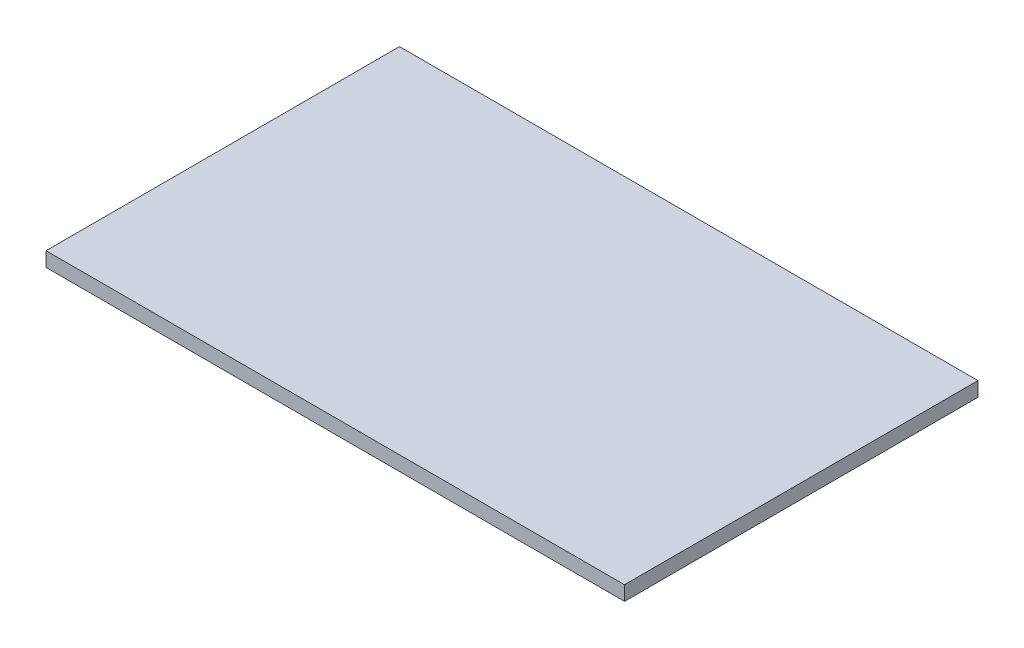
ISO-10303-21;
HEADER;
FILE_DESCRIPTION(('STEP AP214'),'2;1');
FILE_NAME('part.step','',(''),(''),'','','');
FILE_SCHEMA(('AUTOMOTIVE_DESIGN { 1 0 10303 214 1 1 1 1 }'));
ENDSEC;
DATA;
#1=APPLICATION_CONTEXT('core data for automotive mechanical design processes');
#2=APPLICATION_PROTOCOL_DEFINITION('international standard','automotive_design',2000,#1);
#3=PRODUCT_CONTEXT('',#1,'mechanical');
#4=PRODUCT('Part','Part','',(#3));
#5=PRODUCT_RELATED_PRODUCT_CATEGORY('part','',(#4));
#6=PRODUCT_DEFINITION_FORMATION('','',#4);
#7=PRODUCT_DEFINITION_CONTEXT('part definition',#1,'design');
#8=PRODUCT_DEFINITION('design','',#6,#7);
#9=PRODUCT_DEFINITION_SHAPE('','',#8);
#10=(LENGTH_UNIT() NAMED_UNIT(*) SI_UNIT(.MILLI.,.METRE.));
#11=(NAMED_UNIT(*) PLANE_ANGLE_UNIT() SI_UNIT($,.RADIAN.));
#12=(NAMED_UNIT(*) SI_UNIT($,.STERADIAN.) SOLID_ANGLE_UNIT());
#13=UNCERTAINTY_MEASURE_WITH_UNIT(LENGTH_MEASURE(1.E-05),#10,'distance_accuracy_value','');
#14=(GEOMETRIC_REPRESENTATION_CONTEXT(3) GLOBAL_UNCERTAINTY_ASSIGNED_CONTEXT((#13)) GLOBAL_UNIT_ASSIGNED_CONTEXT((#10,
#11,#12)) REPRESENTATION_CONTEXT('',''));
#15=CARTESIAN_POINT('',(0.,0.,0.));
#16=DIRECTION('',(0.,0.,1.));
#17=DIRECTION('',(1.,0.,0.));
#18=AXIS2_PLACEMENT_3D('',#15,#16,#17);
#19=CARTESIAN_POINT('',(3.4307,2.9756,1.6548999999999));
#20=DIRECTION('',(1.,0.,0.));
#21=DIRECTION('',(0.,-1.,0.));
#22=AXIS2_PLACEMENT_3D('',#19,#20,#21);
#23=PLANE('',#22);
#24=DIRECTION('',(0.,0.,1.));
#25=VECTOR('',#24,1.);
#26=CARTESIAN_POINT('',(3.4307,2.9306,1.6548999999999));
#27=LINE('',#26,#25);
#28=CARTESIAN_POINT('',(3.4307,2.9306,0.554899999999976));
#29=VERTEX_POINT('',#28);
#30=CARTESIAN_POINT('',(3.4307,2.9306,1.6548999999999));
#31=VERTEX_POINT('',#30);
#32=EDGE_CURVE('E11',#29,#31,#27,.T.);
#33=ORIENTED_EDGE('',*,*,#32,.T.);
#34=DIRECTION('',(0.,-1.,0.));
#35=VECTOR('',#34,1.);
#36=CARTESIAN_POINT('',(3.4307,2.9756,1.6548999999999));
#37=LINE('',#36,#35);
#38=CARTESIAN_POINT('',(3.4307,2.9756,1.6548999999999));
#39=VERTEX_POINT('',#38);
#40=EDGE_CURVE('E24',#39,#31,#37,.T.);
#41=ORIENTED_EDGE('',*,*,#40,.F.);
#42=DIRECTION('',(0.,0.,1.));
#43=VECTOR('',#42,1.);
#44=CARTESIAN_POINT('',(3.4307,2.9756,1.6548999999999));
#45=LINE('',#44,#43);
#46=CARTESIAN_POINT('',(3.4307,2.9756,0.554899999999976));
#47=VERTEX_POINT('',#46);
#48=EDGE_CURVE('E88',#47,#39,#45,.T.);
#49=ORIENTED_EDGE('',*,*,#48,.F.);
#50=DIRECTION('',(0.,-1.,0.));
#51=VECTOR('',#50,1.);
#52=CARTESIAN_POINT('',(3.4307,2.9756,0.554899999999976));
#53=LINE('',#52,#51);
#54=EDGE_CURVE('E77',#47,#29,#53,.T.);
#55=ORIENTED_EDGE('',*,*,#54,.T.);
#56=EDGE_LOOP('',(#33,#41,#49,#55));
#57=FACE_BOUND('',#56,.T.);
#58=ADVANCED_FACE('F17',(#57),#23,.F.);
#59=CARTESIAN_POINT('',(5.2307,2.9756,1.6548999999999));
#60=DIRECTION('',(0.,0.,-1.));
#61=DIRECTION('',(0.,1.,0.));
#62=AXIS2_PLACEMENT_3D('',#59,#60,#61);
#63=PLANE('',#62);
#64=DIRECTION('',(1.,0.,0.));
#65=VECTOR('',#64,1.);
#66=CARTESIAN_POINT('',(5.2307,2.9306,1.6548999999999));
#67=LINE('',#66,#65);
#68=CARTESIAN_POINT('',(5.2307,2.9306,1.6548999999999));
#69=VERTEX_POINT('',#68);
#70=EDGE_CURVE('E85',#31,#69,#67,.T.);
#71=ORIENTED_EDGE('',*,*,#70,.T.);
#72=DIRECTION('',(0.,-1.,0.));
#73=VECTOR('',#72,1.);
#74=CARTESIAN_POINT('',(5.2307,2.9756,1.6548999999999));
#75=LINE('',#74,#73);
#76=CARTESIAN_POINT('',(5.2307,2.9756,1.6548999999999));
#77=VERTEX_POINT('',#76);
#78=EDGE_CURVE('E83',#77,#69,#75,.T.);
#79=ORIENTED_EDGE('',*,*,#78,.F.);
#80=DIRECTION('',(1.,0.,0.));
#81=VECTOR('',#80,1.);
#82=CARTESIAN_POINT('',(5.2307,2.9756,1.6548999999999));
#83=LINE('',#82,#81);
#84=EDGE_CURVE('E72',#39,#77,#83,.T.);
#85=ORIENTED_EDGE('',*,*,#84,.F.);
#86=ORIENTED_EDGE('',*,*,#40,.T.);
#87=EDGE_LOOP('',(#71,#79,#85,#86));
#88=FACE_BOUND('',#87,.T.);
#89=ADVANCED_FACE('F90',(#88),#63,.F.);
#90=CARTESIAN_POINT('',(5.2307,2.9756,0.554899999999976));
#91=DIRECTION('',(-1.,0.,0.));
#92=DIRECTION('',(0.,1.,0.));
#93=AXIS2_PLACEMENT_3D('',#90,#91,#92);
#94=PLANE('',#93);
#95=DIRECTION('',(0.,0.,-1.));
#96=VECTOR('',#95,1.);
#97=CARTESIAN_POINT('',(5.2307,2.9306,0.554899999999976));
#98=LINE('',#97,#96);
#99=CARTESIAN_POINT('',(5.2307,2.9306,0.554899999999976));
#100=VERTEX_POINT('',#99);
#101=EDGE_CURVE('E60',#69,#100,#98,.T.);
#102=ORIENTED_EDGE('',*,*,#101,.T.);
#103=DIRECTION('',(0.,-1.,0.));
#104=VECTOR('',#103,1.);
#105=CARTESIAN_POINT('',(5.2307,2.9756,0.554899999999976));
#106=LINE('',#105,#104);
#107=CARTESIAN_POINT('',(5.2307,2.9756,0.554899999999976));
#108=VERTEX_POINT('',#107);
#109=EDGE_CURVE('E54',#108,#100,#106,.T.);
#110=ORIENTED_EDGE('',*,*,#109,.F.);
#111=DIRECTION('',(0.,0.,-1.));
#112=VECTOR('',#111,1.);
#113=CARTESIAN_POINT('',(5.2307,2.9756,0.554899999999976));
#114=LINE('',#113,#112);
#115=EDGE_CURVE('E58',#77,#108,#114,.T.);
#116=ORIENTED_EDGE('',*,*,#115,.F.);
#117=ORIENTED_EDGE('',*,*,#78,.T.);
#118=EDGE_LOOP('',(#102,#110,#116,#117));
#119=FACE_BOUND('',#118,.T.);
#120=ADVANCED_FACE('F56',(#119),#94,.F.);
#121=CARTESIAN_POINT('',(3.4307,2.9756,0.554899999999976));
#122=DIRECTION('',(0.,0.,1.));
#123=DIRECTION('',(0.,-1.,0.));
#124=AXIS2_PLACEMENT_3D('',#121,#122,#123);
#125=PLANE('',#124);
#126=DIRECTION('',(-1.,0.,0.));
#127=VECTOR('',#126,1.);
#128=CARTESIAN_POINT('',(3.4307,2.9306,0.554899999999976));
#129=LINE('',#128,#127);
#130=EDGE_CURVE('E73',#100,#29,#129,.T.);
#131=ORIENTED_EDGE('',*,*,#130,.T.);
#132=ORIENTED_EDGE('',*,*,#54,.F.);
#133=DIRECTION('',(-1.,0.,0.));
#134=VECTOR('',#133,1.);
#135=CARTESIAN_POINT('',(3.4307,2.9756,0.554899999999976));
#136=LINE('',#135,#134);
#137=EDGE_CURVE('E70',#108,#47,#136,.T.);
#138=ORIENTED_EDGE('',*,*,#137,.F.);
#139=ORIENTED_EDGE('',*,*,#109,.T.);
#140=EDGE_LOOP('',(#131,#132,#138,#139));
#141=FACE_BOUND('',#140,.T.);
#142=ADVANCED_FACE('F76',(#141),#125,.F.);
#143=CARTESIAN_POINT('',(0.,2.9756,0.));
#144=DIRECTION('',(0.,-1.,0.));
#145=DIRECTION('',(-1.,0.,0.));
#146=AXIS2_PLACEMENT_3D('',#143,#144,#145);
#147=PLANE('',#146);
#148=ORIENTED_EDGE('',*,*,#48,.T.);
#149=ORIENTED_EDGE('',*,*,#84,.T.);
#150=ORIENTED_EDGE('',*,*,#115,.T.);
#151=ORIENTED_EDGE('',*,*,#137,.T.);
#152=EDGE_LOOP('',(#148,#149,#150,#151));
#153=FACE_BOUND('',#152,.T.);
#154=ADVANCED_FACE('F69',(#153),#147,.F.);
#155=CARTESIAN_POINT('',(0.,2.9306,0.));
#156=DIRECTION('',(0.,-1.,0.));
#157=DIRECTION('',(-1.,0.,0.));
#158=AXIS2_PLACEMENT_3D('',#155,#156,#157);
#159=PLANE('',#158);
#160=ORIENTED_EDGE('',*,*,#32,.F.);
#161=ORIENTED_EDGE('',*,*,#130,.F.);
#162=ORIENTED_EDGE('',*,*,#101,.F.);
#163=ORIENTED_EDGE('',*,*,#70,.F.);
#164=EDGE_LOOP('',(#160,#161,#162,#163));
#165=FACE_BOUND('',#164,.T.);
#166=ADVANCED_FACE('F91',(#165),#159,.T.);
#167=CLOSED_SHELL('',(#58,#89,#120,#142,#154,#166));
#168=MANIFOLD_SOLID_BREP('B1',#167);
#169=ADVANCED_BREP_SHAPE_REPRESENTATION('',(#18,#168),#14);
#170=SHAPE_DEFINITION_REPRESENTATION(#9,#169);
ENDSEC;
END-ISO-10303-21;
